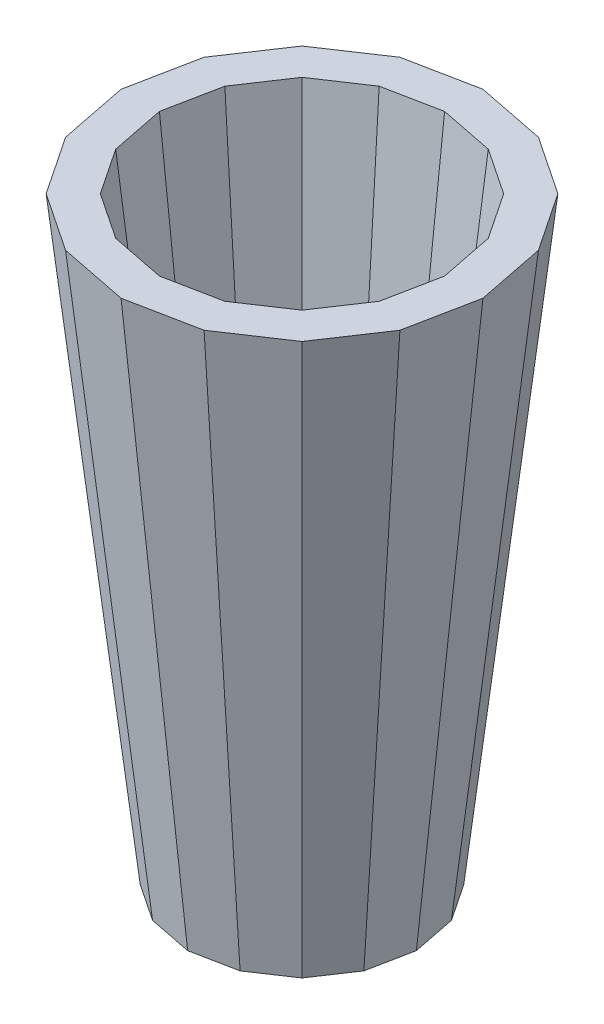
ISO-10303-21;
HEADER;
FILE_DESCRIPTION(('STEP AP214'),'2;1');
FILE_NAME('part.step','',(''),(''),'','','');
FILE_SCHEMA(('AUTOMOTIVE_DESIGN { 1 0 10303 214 1 1 1 1 }'));
ENDSEC;
DATA;
#1=APPLICATION_CONTEXT('core data for automotive mechanical design processes');
#2=APPLICATION_PROTOCOL_DEFINITION('international standard','automotive_design',2000,#1);
#3=PRODUCT_CONTEXT('',#1,'mechanical');
#4=PRODUCT('Part','Part','',(#3));
#5=PRODUCT_RELATED_PRODUCT_CATEGORY('part','',(#4));
#6=PRODUCT_DEFINITION_FORMATION('','',#4);
#7=PRODUCT_DEFINITION_CONTEXT('part definition',#1,'design');
#8=PRODUCT_DEFINITION('design','',#6,#7);
#9=PRODUCT_DEFINITION_SHAPE('','',#8);
#10=(LENGTH_UNIT() NAMED_UNIT(*) SI_UNIT(.MILLI.,.METRE.));
#11=(NAMED_UNIT(*) PLANE_ANGLE_UNIT() SI_UNIT($,.RADIAN.));
#12=(NAMED_UNIT(*) SI_UNIT($,.STERADIAN.) SOLID_ANGLE_UNIT());
#13=UNCERTAINTY_MEASURE_WITH_UNIT(LENGTH_MEASURE(1.E-05),#10,'distance_accuracy_value','');
#14=(GEOMETRIC_REPRESENTATION_CONTEXT(3) GLOBAL_UNCERTAINTY_ASSIGNED_CONTEXT((#13)) GLOBAL_UNIT_ASSIGNED_CONTEXT((#10,
#11,#12)) REPRESENTATION_CONTEXT('',''));
#15=CARTESIAN_POINT('',(0.,0.,0.));
#16=DIRECTION('',(0.,0.,1.));
#17=DIRECTION('',(1.,0.,0.));
#18=AXIS2_PLACEMENT_3D('',#15,#16,#17);
#19=CARTESIAN_POINT('',(97.0556592579951,-12.7354806909715,-64.8505182053685));
#20=DIRECTION('',(0.826564580597358,-0.108460416801212,-0.552292795615895));
#21=DIRECTION('',(-0.555570233019613,0.,-0.831469612302538));
#22=AXIS2_PLACEMENT_3D('',#19,#20,#21);
#23=PLANE('',#22);
#24=DIRECTION('',(-0.0781774113603298,-0.993869500843041,0.078177411360331));
#25=VECTOR('',#24,1.);
#26=CARTESIAN_POINT('',(85.1578574082435,0.,-85.1578574082452));
#27=LINE('',#26,#25);
#28=CARTESIAN_POINT('',(65.1783103261767,-254.,-65.1783103261781));
#29=VERTEX_POINT('',#28);
#30=CARTESIAN_POINT('',(41.2028538276966,-558.8,-41.2028538276976));
#31=VERTEX_POINT('',#30);
#32=EDGE_CURVE('E74',#29,#31,#27,.T.);
#33=ORIENTED_EDGE('',*,*,#32,.F.);
#34=DIRECTION('',(0.555570233019613,0.,0.831469612302538));
#35=VECTOR('',#34,1.);
#36=CARTESIAN_POINT('',(75.1689383557895,-254.,-50.2262788444126));
#37=LINE('',#36,#35);
#38=CARTESIAN_POINT('',(85.1595663854025,-254.,-35.2742473626468));
#39=VERTEX_POINT('',#38);
#40=EDGE_CURVE('E342',#29,#39,#37,.T.);
#41=ORIENTED_EDGE('',*,*,#40,.T.);
#42=DIRECTION('',(-0.102143710373313,-0.993869500843041,0.0423093101477368));
#43=VECTOR('',#42,1.);
#44=CARTESIAN_POINT('',(111.264102657835,0.,-46.087100326149));
#45=LINE('',#44,#43);
#46=CARTESIAN_POINT('',(53.8341228584836,-558.8,-22.2988238064441));
#47=VERTEX_POINT('',#46);
#48=EDGE_CURVE('E389',#39,#47,#45,.T.);
#49=ORIENTED_EDGE('',*,*,#48,.T.);
#50=DIRECTION('',(-0.555570233019613,0.,-0.831469612302538));
#51=VECTOR('',#50,1.);
#52=CARTESIAN_POINT('',(53.8341228584836,-558.8,-22.2988238064441));
#53=LINE('',#52,#51);
#54=EDGE_CURVE('E767',#47,#31,#53,.T.);
#55=ORIENTED_EDGE('',*,*,#54,.T.);
#56=EDGE_LOOP('',(#33,#41,#49,#55));
#57=FACE_BOUND('',#56,.T.);
#58=ADVANCED_FACE('F69',(#57),#23,.T.);
#59=CARTESIAN_POINT('',(64.850518205366,-12.7354806909714,-97.0556592579967));
#60=DIRECTION('',(0.552292795615874,-0.108460416801212,-0.826564580597372));
#61=DIRECTION('',(-0.831469612302552,0.,-0.555570233019592));
#62=AXIS2_PLACEMENT_3D('',#59,#60,#61);
#63=PLANE('',#62);
#64=DIRECTION('',(-0.0423093101477349,-0.993869500843041,0.102143710373314));
#65=VECTOR('',#64,1.);
#66=CARTESIAN_POINT('',(46.0871003261467,0.,-111.264102657836));
#67=LINE('',#66,#65);
#68=CARTESIAN_POINT('',(35.2742473626449,-254.,-85.1595663854033));
#69=VERTEX_POINT('',#68);
#70=CARTESIAN_POINT('',(22.2988238064429,-558.8,-53.8341228584841));
#71=VERTEX_POINT('',#70);
#72=EDGE_CURVE('E655',#69,#71,#67,.T.);
#73=ORIENTED_EDGE('',*,*,#72,.F.);
#74=DIRECTION('',(0.831469612302552,0.,0.555570233019592));
#75=VECTOR('',#74,1.);
#76=CARTESIAN_POINT('',(50.2262788444106,-254.,-75.1689383557908));
#77=LINE('',#76,#75);
#78=EDGE_CURVE('E87',#69,#29,#77,.T.);
#79=ORIENTED_EDGE('',*,*,#78,.T.);
#80=ORIENTED_EDGE('',*,*,#32,.T.);
#81=DIRECTION('',(-0.831469612302552,0.,-0.555570233019592));
#82=VECTOR('',#81,1.);
#83=CARTESIAN_POINT('',(41.2028538276966,-558.8,-41.2028538276976));
#84=LINE('',#83,#82);
#85=EDGE_CURVE('E603',#31,#71,#84,.T.);
#86=ORIENTED_EDGE('',*,*,#85,.T.);
#87=EDGE_LOOP('',(#73,#79,#80,#86));
#88=FACE_BOUND('',#87,.T.);
#89=ADVANCED_FACE('F610',(#88),#63,.T.);
#90=CARTESIAN_POINT('',(114.484956000336,-12.7354806909715,-22.7724736273844));
#91=DIRECTION('',(0.974999401009477,-0.108460416801212,-0.193939439048556));
#92=DIRECTION('',(-0.195090322016141,0.,-0.980785280403228));
#93=AXIS2_PLACEMENT_3D('',#90,#91,#92);
#94=PLANE('',#93);
#95=ORIENTED_EDGE('',*,*,#48,.F.);
#96=DIRECTION('',(0.195090322016141,0.,0.980785280403228));
#97=VECTOR('',#96,1.);
#98=CARTESIAN_POINT('',(88.6678084106225,-254.,-17.637123681324));
#99=LINE('',#98,#97);
#100=CARTESIAN_POINT('',(92.1760504358424,-254.,-1.04255233460427E-12));
#101=VERTEX_POINT('',#100);
#102=EDGE_CURVE('E874',#39,#101,#99,.T.);
#103=ORIENTED_EDGE('',*,*,#102,.T.);
#104=DIRECTION('',(-0.110559555417,-0.993869500843041,0.));
#105=VECTOR('',#104,1.);
#106=CARTESIAN_POINT('',(120.431396889373,0.,-1.3015092548858E-12));
#107=LINE('',#106,#105);
#108=CARTESIAN_POINT('',(58.2696346916054,-558.8,-7.27951394812149E-13));
#109=VERTEX_POINT('',#108);
#110=EDGE_CURVE('E387',#101,#109,#107,.T.);
#111=ORIENTED_EDGE('',*,*,#110,.T.);
#112=DIRECTION('',(-0.195090322016141,0.,-0.980785280403228));
#113=VECTOR('',#112,1.);
#114=CARTESIAN_POINT('',(58.2696346916054,-558.8,-7.27951394812149E-13));
#115=LINE('',#114,#113);
#116=EDGE_CURVE('E785',#109,#47,#115,.T.);
#117=ORIENTED_EDGE('',*,*,#116,.T.);
#118=EDGE_LOOP('',(#95,#103,#111,#117));
#119=FACE_BOUND('',#118,.T.);
#120=ADVANCED_FACE('F619',(#119),#94,.T.);
#121=CARTESIAN_POINT('',(114.484956000337,-12.7354806909714,22.7724736273815));
#122=DIRECTION('',(0.974999401009482,-0.108460416801212,0.193939439048532));
#123=DIRECTION('',(0.195090322016116,0.,-0.980785280403233));
#124=AXIS2_PLACEMENT_3D('',#121,#122,#123);
#125=PLANE('',#124);
#126=ORIENTED_EDGE('',*,*,#110,.F.);
#127=DIRECTION('',(-0.195090322016116,0.,0.980785280403233));
#128=VECTOR('',#127,1.);
#129=CARTESIAN_POINT('',(88.6678084106229,-254.,17.6371236813218));
#130=LINE('',#129,#128);
#131=CARTESIAN_POINT('',(85.1595663854032,-254.,35.2742473626449));
#132=VERTEX_POINT('',#131);
#133=EDGE_CURVE('E876',#101,#132,#130,.T.);
#134=ORIENTED_EDGE('',*,*,#133,.T.);
#135=DIRECTION('',(-0.102143710373314,-0.993869500843041,-0.0423093101477351));
#136=VECTOR('',#135,1.);
#137=CARTESIAN_POINT('',(111.264102657836,0.,46.0871003261467));
#138=LINE('',#137,#136);
#139=CARTESIAN_POINT('',(53.8341228584841,-558.8,22.2988238064428));
#140=VERTEX_POINT('',#139);
#141=EDGE_CURVE('E383',#132,#140,#138,.T.);
#142=ORIENTED_EDGE('',*,*,#141,.T.);
#143=DIRECTION('',(0.195090322016116,0.,-0.980785280403233));
#144=VECTOR('',#143,1.);
#145=CARTESIAN_POINT('',(53.8341228584841,-558.8,22.2988238064428));
#146=LINE('',#145,#144);
#147=EDGE_CURVE('E640',#140,#109,#146,.T.);
#148=ORIENTED_EDGE('',*,*,#147,.T.);
#149=EDGE_LOOP('',(#126,#134,#142,#148));
#150=FACE_BOUND('',#149,.T.);
#151=ADVANCED_FACE('F418',(#150),#125,.T.);
#152=CARTESIAN_POINT('',(97.0556592579967,-12.7354806909714,64.850518205366));
#153=DIRECTION('',(0.826564580597372,-0.108460416801212,0.552292795615874));
#154=DIRECTION('',(0.555570233019592,0.,-0.831469612302552));
#155=AXIS2_PLACEMENT_3D('',#152,#153,#154);
#156=PLANE('',#155);
#157=ORIENTED_EDGE('',*,*,#141,.F.);
#158=DIRECTION('',(-0.555570233019592,0.,0.831469612302552));
#159=VECTOR('',#158,1.);
#160=CARTESIAN_POINT('',(75.1689383557908,-254.,50.2262788444106));
#161=LINE('',#160,#159);
#162=CARTESIAN_POINT('',(65.1783103261781,-254.,65.1783103261767));
#163=VERTEX_POINT('',#162);
#164=EDGE_CURVE('E877',#132,#163,#161,.T.);
#165=ORIENTED_EDGE('',*,*,#164,.T.);
#166=DIRECTION('',(-0.0781774113603309,-0.993869500843041,-0.0781774113603299));
#167=VECTOR('',#166,1.);
#168=CARTESIAN_POINT('',(85.1578574082452,0.,85.1578574082436));
#169=LINE('',#168,#167);
#170=CARTESIAN_POINT('',(41.2028538276976,-558.8,41.2028538276966));
#171=VERTEX_POINT('',#170);
#172=EDGE_CURVE('E380',#163,#171,#169,.T.);
#173=ORIENTED_EDGE('',*,*,#172,.T.);
#174=DIRECTION('',(0.555570233019592,0.,-0.831469612302552));
#175=VECTOR('',#174,1.);
#176=CARTESIAN_POINT('',(41.2028538276976,-558.8,41.2028538276966));
#177=LINE('',#176,#175);
#178=EDGE_CURVE('E399',#171,#140,#177,.T.);
#179=ORIENTED_EDGE('',*,*,#178,.T.);
#180=EDGE_LOOP('',(#157,#165,#173,#179));
#181=FACE_BOUND('',#180,.T.);
#182=ADVANCED_FACE('F407',(#181),#156,.T.);
#183=CARTESIAN_POINT('',(64.8505182053685,-12.7354806909714,97.055659257995));
#184=DIRECTION('',(0.552292795615894,-0.108460416801212,0.826564580597358));
#185=DIRECTION('',(0.831469612302538,0.,-0.555570233019613));
#186=AXIS2_PLACEMENT_3D('',#183,#184,#185);
#187=PLANE('',#186);
#188=ORIENTED_EDGE('',*,*,#172,.F.);
#189=DIRECTION('',(-0.831469612302538,0.,0.555570233019613));
#190=VECTOR('',#189,1.);
#191=CARTESIAN_POINT('',(50.2262788444125,-254.,75.1689383557895));
#192=LINE('',#191,#190);
#193=CARTESIAN_POINT('',(35.2742473626467,-254.,85.1595663854025));
#194=VERTEX_POINT('',#193);
#195=EDGE_CURVE('E841',#163,#194,#192,.T.);
#196=ORIENTED_EDGE('',*,*,#195,.T.);
#197=DIRECTION('',(-0.0423093101477364,-0.993869500843041,-0.102143710373313));
#198=VECTOR('',#197,1.);
#199=CARTESIAN_POINT('',(46.0871003261488,0.,111.264102657835));
#200=LINE('',#199,#198);
#201=CARTESIAN_POINT('',(22.2988238064442,-558.8,53.8341228584836));
#202=VERTEX_POINT('',#201);
#203=EDGE_CURVE('E384',#194,#202,#200,.T.);
#204=ORIENTED_EDGE('',*,*,#203,.T.);
#205=DIRECTION('',(0.831469612302538,0.,-0.555570233019613));
#206=VECTOR('',#205,1.);
#207=CARTESIAN_POINT('',(22.2988238064442,-558.8,53.8341228584836));
#208=LINE('',#207,#206);
#209=EDGE_CURVE('E656',#202,#171,#208,.T.);
#210=ORIENTED_EDGE('',*,*,#209,.T.);
#211=EDGE_LOOP('',(#188,#196,#204,#210));
#212=FACE_BOUND('',#211,.T.);
#213=ADVANCED_FACE('F417',(#212),#187,.T.);
#214=CARTESIAN_POINT('',(22.7724736273844,-12.7354806909714,114.484956000336));
#215=DIRECTION('',(0.193939439048556,-0.108460416801212,0.974999401009477));
#216=DIRECTION('',(0.980785280403228,0.,-0.195090322016141));
#217=AXIS2_PLACEMENT_3D('',#214,#215,#216);
#218=PLANE('',#217);
#219=ORIENTED_EDGE('',*,*,#203,.F.);
#220=DIRECTION('',(-0.980785280403228,0.,0.195090322016141));
#221=VECTOR('',#220,1.);
#222=CARTESIAN_POINT('',(17.637123681324,-254.,88.6678084106224));
#223=LINE('',#222,#221);
#224=CARTESIAN_POINT('',(8.93843344847888E-13,-254.,92.1760504358424));
#225=VERTEX_POINT('',#224);
#226=EDGE_CURVE('E842',#194,#225,#223,.T.);
#227=ORIENTED_EDGE('',*,*,#226,.T.);
#228=DIRECTION('',(0.,-0.993869500843041,-0.110559555417));
#229=VECTOR('',#228,1.);
#230=CARTESIAN_POINT('',(1.02791653552152E-12,0.,120.431396889373));
#231=LINE('',#230,#229);
#232=CARTESIAN_POINT('',(7.14887218187419E-13,-558.8,58.2696346916054));
#233=VERTEX_POINT('',#232);
#234=EDGE_CURVE('E833',#225,#233,#231,.T.);
#235=ORIENTED_EDGE('',*,*,#234,.T.);
#236=DIRECTION('',(0.980785280403228,0.,-0.195090322016141));
#237=VECTOR('',#236,1.);
#238=CARTESIAN_POINT('',(7.14887218187419E-13,-558.8,58.2696346916054));
#239=LINE('',#238,#237);
#240=EDGE_CURVE('E441',#233,#202,#239,.T.);
#241=ORIENTED_EDGE('',*,*,#240,.T.);
#242=EDGE_LOOP('',(#219,#227,#235,#241));
#243=FACE_BOUND('',#242,.T.);
#244=ADVANCED_FACE('F424',(#243),#218,.T.);
#245=CARTESIAN_POINT('',(-22.7724736273815,-12.7354806909714,114.484956000337));
#246=DIRECTION('',(-0.193939439048532,-0.108460416801212,0.974999401009482));
#247=DIRECTION('',(0.980785280403233,0.,0.195090322016116));
#248=AXIS2_PLACEMENT_3D('',#245,#246,#247);
#249=PLANE('',#248);
#250=ORIENTED_EDGE('',*,*,#234,.F.);
#251=DIRECTION('',(-0.980785280403233,0.,-0.195090322016116));
#252=VECTOR('',#251,1.);
#253=CARTESIAN_POINT('',(-17.6371236813218,-254.,88.6678084106229));
#254=LINE('',#253,#252);
#255=CARTESIAN_POINT('',(-35.2742473626449,-254.,85.1595663854033));
#256=VERTEX_POINT('',#255);
#257=EDGE_CURVE('E843',#225,#256,#254,.T.);
#258=ORIENTED_EDGE('',*,*,#257,.T.);
#259=DIRECTION('',(0.0423093101477349,-0.993869500843041,-0.102143710373314));
#260=VECTOR('',#259,1.);
#261=CARTESIAN_POINT('',(-46.0871003261466,0.,111.264102657836));
#262=LINE('',#261,#260);
#263=CARTESIAN_POINT('',(-22.2988238064428,-558.8,53.8341228584841));
#264=VERTEX_POINT('',#263);
#265=EDGE_CURVE('E832',#256,#264,#262,.T.);
#266=ORIENTED_EDGE('',*,*,#265,.T.);
#267=DIRECTION('',(0.980785280403233,0.,0.195090322016116));
#268=VECTOR('',#267,1.);
#269=CARTESIAN_POINT('',(-22.2988238064428,-558.8,53.8341228584841));
#270=LINE('',#269,#268);
#271=EDGE_CURVE('E455',#264,#233,#270,.T.);
#272=ORIENTED_EDGE('',*,*,#271,.T.);
#273=EDGE_LOOP('',(#250,#258,#266,#272));
#274=FACE_BOUND('',#273,.T.);
#275=ADVANCED_FACE('F461',(#274),#249,.T.);
#276=CARTESIAN_POINT('',(-64.8505182053661,-12.7354806909714,97.0556592579966));
#277=DIRECTION('',(-0.552292795615874,-0.108460416801212,0.826564580597372));
#278=DIRECTION('',(0.831469612302552,0.,0.555570233019592));
#279=AXIS2_PLACEMENT_3D('',#276,#277,#278);
#280=PLANE('',#279);
#281=ORIENTED_EDGE('',*,*,#265,.F.);
#282=DIRECTION('',(-0.831469612302552,0.,-0.555570233019592));
#283=VECTOR('',#282,1.);
#284=CARTESIAN_POINT('',(-50.2262788444107,-254.,75.1689383557907));
#285=LINE('',#284,#283);
#286=CARTESIAN_POINT('',(-65.1783103261767,-254.,65.178310326178));
#287=VERTEX_POINT('',#286);
#288=EDGE_CURVE('E847',#256,#287,#285,.T.);
#289=ORIENTED_EDGE('',*,*,#288,.T.);
#290=DIRECTION('',(0.0781774113603299,-0.993869500843041,-0.0781774113603309));
#291=VECTOR('',#290,1.);
#292=CARTESIAN_POINT('',(-85.1578574082436,0.,85.1578574082451));
#293=LINE('',#292,#291);
#294=CARTESIAN_POINT('',(-41.2028538276966,-558.8,41.2028538276976));
#295=VERTEX_POINT('',#294);
#296=EDGE_CURVE('E830',#287,#295,#293,.T.);
#297=ORIENTED_EDGE('',*,*,#296,.T.);
#298=DIRECTION('',(0.831469612302552,0.,0.555570233019592));
#299=VECTOR('',#298,1.);
#300=CARTESIAN_POINT('',(-41.2028538276966,-558.8,41.2028538276976));
#301=LINE('',#300,#299);
#302=EDGE_CURVE('E692',#295,#264,#301,.T.);
#303=ORIENTED_EDGE('',*,*,#302,.T.);
#304=EDGE_LOOP('',(#281,#289,#297,#303));
#305=FACE_BOUND('',#304,.T.);
#306=ADVANCED_FACE('F470',(#305),#280,.T.);
#307=CARTESIAN_POINT('',(-97.055659257995,-12.7354806909715,64.8505182053685));
#308=DIRECTION('',(-0.826564580597358,-0.108460416801212,0.552292795615895));
#309=DIRECTION('',(0.555570233019613,0.,0.831469612302538));
#310=AXIS2_PLACEMENT_3D('',#307,#308,#309);
#311=PLANE('',#310);
#312=ORIENTED_EDGE('',*,*,#296,.F.);
#313=DIRECTION('',(-0.555570233019613,0.,-0.831469612302538));
#314=VECTOR('',#313,1.);
#315=CARTESIAN_POINT('',(-75.1689383557895,-254.,50.2262788444126));
#316=LINE('',#315,#314);
#317=CARTESIAN_POINT('',(-85.1595663854025,-254.,35.2742473626467));
#318=VERTEX_POINT('',#317);
#319=EDGE_CURVE('E926',#287,#318,#316,.T.);
#320=ORIENTED_EDGE('',*,*,#319,.T.);
#321=DIRECTION('',(0.102143710373313,-0.993869500843041,-0.0423093101477365));
#322=VECTOR('',#321,1.);
#323=CARTESIAN_POINT('',(-111.264102657835,0.,46.0871003261489));
#324=LINE('',#323,#322);
#325=CARTESIAN_POINT('',(-53.8341228584836,-558.8,22.2988238064441));
#326=VERTEX_POINT('',#325);
#327=EDGE_CURVE('E828',#318,#326,#324,.T.);
#328=ORIENTED_EDGE('',*,*,#327,.T.);
#329=DIRECTION('',(0.555570233019613,0.,0.831469612302538));
#330=VECTOR('',#329,1.);
#331=CARTESIAN_POINT('',(-53.8341228584836,-558.8,22.2988238064441));
#332=LINE('',#331,#330);
#333=EDGE_CURVE('E491',#326,#295,#332,.T.);
#334=ORIENTED_EDGE('',*,*,#333,.T.);
#335=EDGE_LOOP('',(#312,#320,#328,#334));
#336=FACE_BOUND('',#335,.T.);
#337=ADVANCED_FACE('F474',(#336),#311,.T.);
#338=CARTESIAN_POINT('',(-114.484956000336,-12.7354806909715,22.7724736273844));
#339=DIRECTION('',(-0.974999401009477,-0.108460416801212,0.193939439048556));
#340=DIRECTION('',(0.19509032201614,0.,0.980785280403228));
#341=AXIS2_PLACEMENT_3D('',#338,#339,#340);
#342=PLANE('',#341);
#343=ORIENTED_EDGE('',*,*,#327,.F.);
#344=DIRECTION('',(-0.19509032201614,0.,-0.980785280403228));
#345=VECTOR('',#344,1.);
#346=CARTESIAN_POINT('',(-88.6678084106224,-254.,17.637123681324));
#347=LINE('',#346,#345);
#348=CARTESIAN_POINT('',(-92.1760504358424,-254.,9.89884406966494E-13));
#349=VERTEX_POINT('',#348);
#350=EDGE_CURVE('E923',#318,#349,#347,.T.);
#351=ORIENTED_EDGE('',*,*,#350,.T.);
#352=DIRECTION('',(0.110559555417,-0.993869500843041,0.));
#353=VECTOR('',#352,1.);
#354=CARTESIAN_POINT('',(-120.431396889373,0.,1.19026914763061E-12));
#355=LINE('',#354,#353);
#356=CARTESIAN_POINT('',(-58.2696346916054,-558.8,7.28926824738035E-13));
#357=VERTEX_POINT('',#356);
#358=EDGE_CURVE('E818',#349,#357,#355,.T.);
#359=ORIENTED_EDGE('',*,*,#358,.T.);
#360=DIRECTION('',(0.19509032201614,0.,0.980785280403228));
#361=VECTOR('',#360,1.);
#362=CARTESIAN_POINT('',(-58.2696346916054,-558.8,7.28926824738035E-13));
#363=LINE('',#362,#361);
#364=EDGE_CURVE('E505',#357,#326,#363,.T.);
#365=ORIENTED_EDGE('',*,*,#364,.T.);
#366=EDGE_LOOP('',(#343,#351,#359,#365));
#367=FACE_BOUND('',#366,.T.);
#368=ADVANCED_FACE('F511',(#367),#342,.T.);
#369=CARTESIAN_POINT('',(-114.484956000337,-12.7354806909714,-22.7724736273815));
#370=DIRECTION('',(-0.974999401009482,-0.108460416801212,-0.193939439048532));
#371=DIRECTION('',(-0.195090322016116,0.,0.980785280403233));
#372=AXIS2_PLACEMENT_3D('',#369,#370,#371);
#373=PLANE('',#372);
#374=ORIENTED_EDGE('',*,*,#358,.F.);
#375=DIRECTION('',(0.195090322016116,0.,-0.980785280403233));
#376=VECTOR('',#375,1.);
#377=CARTESIAN_POINT('',(-88.6678084106228,-254.,-17.6371236813218));
#378=LINE('',#377,#376);
#379=CARTESIAN_POINT('',(-85.1595663854032,-254.,-35.2742473626449));
#380=VERTEX_POINT('',#379);
#381=EDGE_CURVE('E920',#349,#380,#378,.T.);
#382=ORIENTED_EDGE('',*,*,#381,.T.);
#383=DIRECTION('',(0.102143710373314,-0.993869500843041,0.0423093101477353));
#384=VECTOR('',#383,1.);
#385=CARTESIAN_POINT('',(-111.264102657836,0.,-46.0871003261468));
#386=LINE('',#385,#384);
#387=CARTESIAN_POINT('',(-53.8341228584841,-558.8,-22.2988238064427));
#388=VERTEX_POINT('',#387);
#389=EDGE_CURVE('E816',#380,#388,#386,.T.);
#390=ORIENTED_EDGE('',*,*,#389,.T.);
#391=DIRECTION('',(-0.195090322016116,0.,0.980785280403233));
#392=VECTOR('',#391,1.);
#393=CARTESIAN_POINT('',(-53.8341228584841,-558.8,-22.2988238064427));
#394=LINE('',#393,#392);
#395=EDGE_CURVE('E712',#388,#357,#394,.T.);
#396=ORIENTED_EDGE('',*,*,#395,.T.);
#397=EDGE_LOOP('',(#374,#382,#390,#396));
#398=FACE_BOUND('',#397,.T.);
#399=ADVANCED_FACE('F520',(#398),#373,.T.);
#400=CARTESIAN_POINT('',(-97.0556592579967,-12.7354806909714,-64.850518205366));
#401=DIRECTION('',(-0.826564580597372,-0.108460416801212,-0.552292795615874));
#402=DIRECTION('',(-0.555570233019592,0.,0.831469612302552));
#403=AXIS2_PLACEMENT_3D('',#400,#401,#402);
#404=PLANE('',#403);
#405=ORIENTED_EDGE('',*,*,#389,.F.);
#406=DIRECTION('',(0.555570233019592,0.,-0.831469612302552));
#407=VECTOR('',#406,1.);
#408=CARTESIAN_POINT('',(-75.1689383557908,-254.,-50.2262788444106));
#409=LINE('',#408,#407);
#410=CARTESIAN_POINT('',(-65.1783103261781,-254.,-65.1783103261767));
#411=VERTEX_POINT('',#410);
#412=EDGE_CURVE('E917',#380,#411,#409,.T.);
#413=ORIENTED_EDGE('',*,*,#412,.T.);
#414=DIRECTION('',(0.0781774113603309,-0.993869500843041,0.0781774113603299));
#415=VECTOR('',#414,1.);
#416=CARTESIAN_POINT('',(-85.1578574082452,0.,-85.1578574082436));
#417=LINE('',#416,#415);
#418=CARTESIAN_POINT('',(-41.2028538276976,-558.8,-41.2028538276965));
#419=VERTEX_POINT('',#418);
#420=EDGE_CURVE('E814',#411,#419,#417,.T.);
#421=ORIENTED_EDGE('',*,*,#420,.T.);
#422=DIRECTION('',(-0.555570233019592,0.,0.831469612302552));
#423=VECTOR('',#422,1.);
#424=CARTESIAN_POINT('',(-41.2028538276976,-558.8,-41.2028538276965));
#425=LINE('',#424,#423);
#426=EDGE_CURVE('E541',#419,#388,#425,.T.);
#427=ORIENTED_EDGE('',*,*,#426,.T.);
#428=EDGE_LOOP('',(#405,#413,#421,#427));
#429=FACE_BOUND('',#428,.T.);
#430=ADVANCED_FACE('F524',(#429),#404,.T.);
#431=CARTESIAN_POINT('',(-64.8505182053685,-12.7354806909715,-97.0556592579951));
#432=DIRECTION('',(-0.552292795615894,-0.108460416801212,-0.826564580597358));
#433=DIRECTION('',(-0.831469612302538,0.,0.555570233019612));
#434=AXIS2_PLACEMENT_3D('',#431,#432,#433);
#435=PLANE('',#434);
#436=ORIENTED_EDGE('',*,*,#420,.F.);
#437=DIRECTION('',(0.831469612302538,0.,-0.555570233019612));
#438=VECTOR('',#437,1.);
#439=CARTESIAN_POINT('',(-50.2262788444125,-254.,-75.1689383557895));
#440=LINE('',#439,#438);
#441=CARTESIAN_POINT('',(-35.2742473626466,-254.,-85.1595663854025));
#442=VERTEX_POINT('',#441);
#443=EDGE_CURVE('E914',#411,#442,#440,.T.);
#444=ORIENTED_EDGE('',*,*,#443,.T.);
#445=DIRECTION('',(0.0423093101477363,-0.993869500843041,0.102143710373313));
#446=VECTOR('',#445,1.);
#447=CARTESIAN_POINT('',(-46.0871003261487,0.,-111.264102657835));
#448=LINE('',#447,#446);
#449=CARTESIAN_POINT('',(-22.2988238064441,-558.8,-53.8341228584835));
#450=VERTEX_POINT('',#449);
#451=EDGE_CURVE('E812',#442,#450,#448,.T.);
#452=ORIENTED_EDGE('',*,*,#451,.T.);
#453=DIRECTION('',(-0.831469612302538,0.,0.555570233019612));
#454=VECTOR('',#453,1.);
#455=CARTESIAN_POINT('',(-22.2988238064441,-558.8,-53.8341228584835));
#456=LINE('',#455,#454);
#457=EDGE_CURVE('E555',#450,#419,#456,.T.);
#458=ORIENTED_EDGE('',*,*,#457,.T.);
#459=EDGE_LOOP('',(#436,#444,#452,#458));
#460=FACE_BOUND('',#459,.T.);
#461=ADVANCED_FACE('F561',(#460),#435,.T.);
#462=CARTESIAN_POINT('',(-22.7724736273844,-12.7354806909715,-114.484956000336));
#463=DIRECTION('',(-0.193939439048556,-0.108460416801212,-0.974999401009477));
#464=DIRECTION('',(-0.980785280403228,0.,0.195090322016141));
#465=AXIS2_PLACEMENT_3D('',#462,#463,#464);
#466=PLANE('',#465);
#467=ORIENTED_EDGE('',*,*,#451,.F.);
#468=DIRECTION('',(0.980785280403228,0.,-0.195090322016141));
#469=VECTOR('',#468,1.);
#470=CARTESIAN_POINT('',(-17.637123681324,-254.,-88.6678084106224));
#471=LINE('',#470,#469);
#472=CARTESIAN_POINT('',(-9.65712964078461E-13,-254.,-92.1760504358424));
#473=VERTEX_POINT('',#472);
#474=EDGE_CURVE('E911',#442,#473,#471,.T.);
#475=ORIENTED_EDGE('',*,*,#474,.T.);
#476=DIRECTION('',(0.,-0.993869500843041,0.110559555417));
#477=VECTOR('',#476,1.);
#478=CARTESIAN_POINT('',(-1.14021109936577E-12,0.,-120.431396889373));
#479=LINE('',#478,#477);
#480=CARTESIAN_POINT('',(-7.51337183597178E-13,-558.8,-58.2696346916053));
#481=VERTEX_POINT('',#480);
#482=EDGE_CURVE('E801',#473,#481,#479,.T.);
#483=ORIENTED_EDGE('',*,*,#482,.T.);
#484=DIRECTION('',(-0.980785280403228,0.,0.195090322016141));
#485=VECTOR('',#484,1.);
#486=CARTESIAN_POINT('',(-7.51337183597178E-13,-558.8,-58.2696346916053));
#487=LINE('',#486,#485);
#488=EDGE_CURVE('E747',#481,#450,#487,.T.);
#489=ORIENTED_EDGE('',*,*,#488,.T.);
#490=EDGE_LOOP('',(#467,#475,#483,#489));
#491=FACE_BOUND('',#490,.T.);
#492=ADVANCED_FACE('F570',(#491),#466,.T.);
#493=CARTESIAN_POINT('',(22.7724736273815,-12.7354806909715,-114.484956000337));
#494=DIRECTION('',(0.193939439048532,-0.108460416801212,-0.974999401009482));
#495=DIRECTION('',(-0.980785280403233,0.,-0.195090322016116));
#496=AXIS2_PLACEMENT_3D('',#493,#494,#495);
#497=PLANE('',#496);
#498=ORIENTED_EDGE('',*,*,#482,.F.);
#499=DIRECTION('',(0.980785280403233,0.,0.195090322016116));
#500=VECTOR('',#499,1.);
#501=CARTESIAN_POINT('',(17.6371236813218,-254.,-88.6678084106229));
#502=LINE('',#501,#500);
#503=EDGE_CURVE('E909',#473,#69,#502,.T.);
#504=ORIENTED_EDGE('',*,*,#503,.T.);
#505=ORIENTED_EDGE('',*,*,#72,.T.);
#506=DIRECTION('',(-0.980785280403233,0.,-0.195090322016116));
#507=VECTOR('',#506,1.);
#508=CARTESIAN_POINT('',(22.2988238064429,-558.8,-53.8341228584841));
#509=LINE('',#508,#507);
#510=EDGE_CURVE('E589',#71,#481,#509,.T.);
#511=ORIENTED_EDGE('',*,*,#510,.T.);
#512=EDGE_LOOP('',(#498,#504,#505,#511));
#513=FACE_BOUND('',#512,.T.);
#514=ADVANCED_FACE('F573',(#513),#497,.T.);
#515=CARTESIAN_POINT('',(81.3096039976154,-10.6693097509084,-54.3293404488857));
#516=DIRECTION('',(0.826564580597358,-0.108460416801212,-0.552292795615895));
#517=DIRECTION('',(-0.555570233019613,0.,-0.831469612302538));
#518=AXIS2_PLACEMENT_3D('',#515,#516,#517);
#519=PLANE('',#518);
#520=DIRECTION('',(0.555570233019613,0.,0.831469612302538));
#521=VECTOR('',#520,1.);
#522=CARTESIAN_POINT('',(59.23544688709,-254.,-39.5798602175578));
#523=LINE('',#522,#521);
#524=CARTESIAN_POINT('',(51.3625231906597,-254.,-51.3625231906608));
#525=VERTEX_POINT('',#524);
#526=CARTESIAN_POINT('',(67.1083705835203,-254.,-27.7971972444547));
#527=VERTEX_POINT('',#526);
#528=EDGE_CURVE('E291',#525,#527,#523,.T.);
#529=ORIENTED_EDGE('',*,*,#528,.F.);
#530=DIRECTION('',(-0.0781774113603295,-0.993869500843041,0.0781774113603312));
#531=VECTOR('',#530,1.);
#532=CARTESIAN_POINT('',(70.4700265198488,-11.086293013605,-70.4700265198503));
#533=LINE('',#532,#531);
#534=CARTESIAN_POINT('',(27.3870666921796,-558.8,-27.3870666921802));
#535=VERTEX_POINT('',#534);
#536=EDGE_CURVE('E290',#525,#535,#533,.T.);
#537=ORIENTED_EDGE('',*,*,#536,.T.);
#538=DIRECTION('',(-0.555570233019613,0.,-0.831469612302538));
#539=VECTOR('',#538,1.);
#540=CARTESIAN_POINT('',(31.5849968743905,-558.8,-21.1044201902161));
#541=LINE('',#540,#539);
#542=CARTESIAN_POINT('',(35.7829270566015,-558.8,-14.8217736882519));
#543=VERTEX_POINT('',#542);
#544=EDGE_CURVE('E333',#543,#535,#541,.T.);
#545=ORIENTED_EDGE('',*,*,#544,.F.);
#546=DIRECTION('',(-0.102143710373313,-0.993869500843041,0.0423093101477372));
#547=VECTOR('',#546,1.);
#548=CARTESIAN_POINT('',(92.073526784691,-11.086293013605,-38.1381035297428));
#549=LINE('',#548,#547);
#550=EDGE_CURVE('E332',#527,#543,#549,.T.);
#551=ORIENTED_EDGE('',*,*,#550,.F.);
#552=EDGE_LOOP('',(#529,#537,#545,#551));
#553=FACE_BOUND('',#552,.T.);
#554=ADVANCED_FACE('F891',(#553),#519,.F.);
#555=CARTESIAN_POINT('',(54.3293404488836,-10.6693097509084,-81.3096039976167));
#556=DIRECTION('',(0.552292795615874,-0.108460416801212,-0.826564580597372));
#557=DIRECTION('',(-0.831469612302552,0.,-0.555570233019592));
#558=AXIS2_PLACEMENT_3D('',#555,#556,#557);
#559=PLANE('',#558);
#560=DIRECTION('',(0.831469612302552,0.,0.555570233019592));
#561=VECTOR('',#560,1.);
#562=CARTESIAN_POINT('',(39.5798602175563,-254.,-59.2354468870909));
#563=LINE('',#562,#561);
#564=CARTESIAN_POINT('',(27.797197244453,-254.,-67.108370583521));
#565=VERTEX_POINT('',#564);
#566=EDGE_CURVE('E279',#565,#525,#563,.T.);
#567=ORIENTED_EDGE('',*,*,#566,.F.);
#568=DIRECTION('',(-0.0423093101477342,-0.993869500843041,0.102143710373314));
#569=VECTOR('',#568,1.);
#570=CARTESIAN_POINT('',(38.1381035297404,-11.086293013605,-92.073526784692));
#571=LINE('',#570,#569);
#572=CARTESIAN_POINT('',(14.8217736882511,-558.8,-35.7829270566018));
#573=VERTEX_POINT('',#572);
#574=EDGE_CURVE('E288',#565,#573,#571,.T.);
#575=ORIENTED_EDGE('',*,*,#574,.T.);
#576=DIRECTION('',(-0.831469612302552,0.,-0.555570233019592));
#577=VECTOR('',#576,1.);
#578=CARTESIAN_POINT('',(21.1044201902153,-558.8,-31.584996874391));
#579=LINE('',#578,#577);
#580=EDGE_CURVE('E336',#535,#573,#579,.T.);
#581=ORIENTED_EDGE('',*,*,#580,.F.);
#582=ORIENTED_EDGE('',*,*,#536,.F.);
#583=EDGE_LOOP('',(#567,#575,#581,#582));
#584=FACE_BOUND('',#583,.T.);
#585=ADVANCED_FACE('F286',(#584),#559,.F.);
#586=CARTESIAN_POINT('',(95.9112174111059,-10.6693097509084,-19.0779273135094));
#587=DIRECTION('',(0.974999401009477,-0.108460416801212,-0.193939439048556));
#588=DIRECTION('',(-0.195090322016141,0.,-0.980785280403228));
#589=AXIS2_PLACEMENT_3D('',#586,#587,#588);
#590=PLANE('',#589);
#591=DIRECTION('',(0.195090322016141,0.,0.980785280403228));
#592=VECTOR('',#591,1.);
#593=CARTESIAN_POINT('',(69.8729737387273,-254.,-13.8985986222278));
#594=LINE('',#593,#592);
#595=CARTESIAN_POINT('',(72.6375768939343,-254.,-1.01654795692241E-12));
#596=VERTEX_POINT('',#595);
#597=EDGE_CURVE('E292',#527,#596,#594,.T.);
#598=ORIENTED_EDGE('',*,*,#597,.F.);
#599=ORIENTED_EDGE('',*,*,#550,.T.);
#600=DIRECTION('',(-0.195090322016141,0.,-0.980785280403228));
#601=VECTOR('',#600,1.);
#602=CARTESIAN_POINT('',(37.2570441031494,-558.8,-7.41088684412626));
#603=LINE('',#602,#601);
#604=CARTESIAN_POINT('',(38.7311611496973,-558.8,-5.19844429068119E-13));
#605=VERTEX_POINT('',#604);
#606=EDGE_CURVE('E337',#605,#543,#603,.T.);
#607=ORIENTED_EDGE('',*,*,#606,.F.);
#608=DIRECTION('',(-0.110559555417,-0.993869500843041,0.));
#609=VECTOR('',#608,1.);
#610=CARTESIAN_POINT('',(99.6596672451629,-11.086293013605,-1.37043154602168E-12));
#611=LINE('',#610,#609);
#612=EDGE_CURVE('E330',#596,#605,#611,.T.);
#613=ORIENTED_EDGE('',*,*,#612,.F.);
#614=EDGE_LOOP('',(#598,#599,#607,#613));
#615=FACE_BOUND('',#614,.T.);
#616=ADVANCED_FACE('F894',(#615),#590,.F.);
#617=CARTESIAN_POINT('',(95.9112174111063,-10.6693097509084,19.077927313507));
#618=DIRECTION('',(0.974999401009482,-0.108460416801212,0.193939439048532));
#619=DIRECTION('',(0.195090322016116,0.,-0.980785280403233));
#620=AXIS2_PLACEMENT_3D('',#617,#618,#619);
#621=PLANE('',#620);
#622=DIRECTION('',(-0.195090322016116,0.,0.980785280403233));
#623=VECTOR('',#622,1.);
#624=CARTESIAN_POINT('',(69.8729737387276,-254.,13.8985986222261));
#625=LINE('',#624,#623);
#626=CARTESIAN_POINT('',(67.108370583521,-254.,27.797197244453));
#627=VERTEX_POINT('',#626);
#628=EDGE_CURVE('E899',#596,#627,#625,.T.);
#629=ORIENTED_EDGE('',*,*,#628,.F.);
#630=ORIENTED_EDGE('',*,*,#612,.T.);
#631=DIRECTION('',(0.195090322016116,0.,-0.980785280403233));
#632=VECTOR('',#631,1.);
#633=CARTESIAN_POINT('',(37.2570441031495,-558.8,7.41088684412532));
#634=LINE('',#633,#632);
#635=CARTESIAN_POINT('',(35.7829270566018,-558.8,14.821773688251));
#636=VERTEX_POINT('',#635);
#637=EDGE_CURVE('E340',#636,#605,#634,.T.);
#638=ORIENTED_EDGE('',*,*,#637,.F.);
#639=DIRECTION('',(-0.102143710373314,-0.993869500843041,-0.0423093101477346));
#640=VECTOR('',#639,1.);
#641=CARTESIAN_POINT('',(92.0735267846919,-11.086293013605,38.1381035297404));
#642=LINE('',#641,#640);
#643=EDGE_CURVE('E328',#627,#636,#642,.T.);
#644=ORIENTED_EDGE('',*,*,#643,.F.);
#645=EDGE_LOOP('',(#629,#630,#638,#644));
#646=FACE_BOUND('',#645,.T.);
#647=ADVANCED_FACE('F897',(#646),#621,.F.);
#648=CARTESIAN_POINT('',(81.3096039976167,-10.6693097509084,54.3293404488836));
#649=DIRECTION('',(0.826564580597372,-0.108460416801212,0.552292795615874));
#650=DIRECTION('',(0.555570233019592,0.,-0.831469612302552));
#651=AXIS2_PLACEMENT_3D('',#648,#649,#650);
#652=PLANE('',#651);
#653=DIRECTION('',(-0.555570233019592,0.,0.831469612302552));
#654=VECTOR('',#653,1.);
#655=CARTESIAN_POINT('',(59.2354468870909,-254.,39.5798602175563));
#656=LINE('',#655,#654);
#657=CARTESIAN_POINT('',(51.3625231906608,-254.,51.3625231906595));
#658=VERTEX_POINT('',#657);
#659=EDGE_CURVE('E901',#627,#658,#656,.T.);
#660=ORIENTED_EDGE('',*,*,#659,.F.);
#661=ORIENTED_EDGE('',*,*,#643,.T.);
#662=DIRECTION('',(0.555570233019592,0.,-0.831469612302552));
#663=VECTOR('',#662,1.);
#664=CARTESIAN_POINT('',(31.584996874391,-558.8,21.1044201902153));
#665=LINE('',#664,#663);
#666=CARTESIAN_POINT('',(27.3870666921802,-558.8,27.3870666921795));
#667=VERTEX_POINT('',#666);
#668=EDGE_CURVE('E299',#667,#636,#665,.T.);
#669=ORIENTED_EDGE('',*,*,#668,.F.);
#670=DIRECTION('',(-0.0781774113603313,-0.993869500843041,-0.0781774113603293));
#671=VECTOR('',#670,1.);
#672=CARTESIAN_POINT('',(70.4700265198504,-11.086293013605,70.4700265198486));
#673=LINE('',#672,#671);
#674=EDGE_CURVE('E326',#658,#667,#673,.T.);
#675=ORIENTED_EDGE('',*,*,#674,.F.);
#676=EDGE_LOOP('',(#660,#661,#669,#675));
#677=FACE_BOUND('',#676,.T.);
#678=ADVANCED_FACE('F952',(#677),#652,.F.);
#679=CARTESIAN_POINT('',(54.3293404488857,-10.6693097509084,81.3096039976154));
#680=DIRECTION('',(0.552292795615894,-0.108460416801212,0.826564580597358));
#681=DIRECTION('',(0.831469612302538,0.,-0.555570233019613));
#682=AXIS2_PLACEMENT_3D('',#679,#680,#681);
#683=PLANE('',#682);
#684=DIRECTION('',(-0.831469612302538,0.,0.555570233019613));
#685=VECTOR('',#684,1.);
#686=CARTESIAN_POINT('',(39.5798602175578,-254.,59.2354468870899));
#687=LINE('',#686,#685);
#688=CARTESIAN_POINT('',(27.7971972444547,-254.,67.1083705835203));
#689=VERTEX_POINT('',#688);
#690=EDGE_CURVE('E904',#658,#689,#687,.T.);
#691=ORIENTED_EDGE('',*,*,#690,.F.);
#692=ORIENTED_EDGE('',*,*,#674,.T.);
#693=DIRECTION('',(0.831469612302538,0.,-0.555570233019613));
#694=VECTOR('',#693,1.);
#695=CARTESIAN_POINT('',(21.1044201902161,-558.8,31.5849968743905));
#696=LINE('',#695,#694);
#697=CARTESIAN_POINT('',(14.821773688252,-558.8,35.7829270566014));
#698=VERTEX_POINT('',#697);
#699=EDGE_CURVE('E304',#698,#667,#696,.T.);
#700=ORIENTED_EDGE('',*,*,#699,.F.);
#701=DIRECTION('',(-0.0423093101477371,-0.993869500843041,-0.102143710373313));
#702=VECTOR('',#701,1.);
#703=CARTESIAN_POINT('',(38.1381035297428,-11.086293013605,92.073526784691));
#704=LINE('',#703,#702);
#705=EDGE_CURVE('E324',#689,#698,#704,.T.);
#706=ORIENTED_EDGE('',*,*,#705,.F.);
#707=EDGE_LOOP('',(#691,#692,#700,#706));
#708=FACE_BOUND('',#707,.T.);
#709=ADVANCED_FACE('F955',(#708),#683,.F.);
#710=CARTESIAN_POINT('',(19.0779273135094,-10.6693097509083,95.9112174111058));
#711=DIRECTION('',(0.193939439048556,-0.108460416801212,0.974999401009477));
#712=DIRECTION('',(0.980785280403228,0.,-0.195090322016141));
#713=AXIS2_PLACEMENT_3D('',#710,#711,#712);
#714=PLANE('',#713);
#715=DIRECTION('',(-0.980785280403228,0.,0.195090322016141));
#716=VECTOR('',#715,1.);
#717=CARTESIAN_POINT('',(13.8985986222278,-254.,69.8729737387273));
#718=LINE('',#717,#716);
#719=CARTESIAN_POINT('',(9.26342336171615E-13,-254.,72.6375768939343));
#720=VERTEX_POINT('',#719);
#721=EDGE_CURVE('E1029',#689,#720,#718,.T.);
#722=ORIENTED_EDGE('',*,*,#721,.F.);
#723=ORIENTED_EDGE('',*,*,#705,.T.);
#724=DIRECTION('',(0.980785280403228,0.,-0.195090322016141));
#725=VECTOR('',#724,1.);
#726=CARTESIAN_POINT('',(7.41088684412624,-558.8,37.2570441031493));
#727=LINE('',#726,#725);
#728=CARTESIAN_POINT('',(5.03884714836985E-13,-558.8,38.7311611496972));
#729=VERTEX_POINT('',#728);
#730=EDGE_CURVE('E346',#729,#698,#727,.T.);
#731=ORIENTED_EDGE('',*,*,#730,.F.);
#732=DIRECTION('',(0.,-0.993869500843041,-0.110559555417));
#733=VECTOR('',#732,1.);
#734=CARTESIAN_POINT('',(1.19002030452009E-12,-11.086293013605,99.6596672451629));
#735=LINE('',#734,#733);
#736=EDGE_CURVE('E322',#720,#729,#735,.T.);
#737=ORIENTED_EDGE('',*,*,#736,.F.);
#738=EDGE_LOOP('',(#722,#723,#731,#737));
#739=FACE_BOUND('',#738,.T.);
#740=ADVANCED_FACE('F959',(#739),#714,.F.);
#741=CARTESIAN_POINT('',(-19.077927313507,-10.6693097509084,95.9112174111063));
#742=DIRECTION('',(-0.193939439048532,-0.108460416801212,0.974999401009482));
#743=DIRECTION('',(0.980785280403233,0.,0.195090322016116));
#744=AXIS2_PLACEMENT_3D('',#741,#742,#743);
#745=PLANE('',#744);
#746=DIRECTION('',(-0.980785280403233,0.,-0.195090322016116));
#747=VECTOR('',#746,1.);
#748=CARTESIAN_POINT('',(-13.8985986222261,-254.,69.8729737387276));
#749=LINE('',#748,#747);
#750=CARTESIAN_POINT('',(-27.797197244453,-254.,67.108370583521));
#751=VERTEX_POINT('',#750);
#752=EDGE_CURVE('E1033',#720,#751,#749,.T.);
#753=ORIENTED_EDGE('',*,*,#752,.F.);
#754=ORIENTED_EDGE('',*,*,#736,.T.);
#755=DIRECTION('',(0.980785280403233,0.,0.195090322016116));
#756=VECTOR('',#755,1.);
#757=CARTESIAN_POINT('',(-7.41088684412532,-558.8,37.2570441031495));
#758=LINE('',#757,#756);
#759=CARTESIAN_POINT('',(-14.821773688251,-558.8,35.7829270566018));
#760=VERTEX_POINT('',#759);
#761=EDGE_CURVE('E349',#760,#729,#758,.T.);
#762=ORIENTED_EDGE('',*,*,#761,.F.);
#763=DIRECTION('',(0.0423093101477345,-0.993869500843041,-0.102143710373314));
#764=VECTOR('',#763,1.);
#765=CARTESIAN_POINT('',(-38.1381035297404,-11.086293013605,92.0735267846919));
#766=LINE('',#765,#764);
#767=EDGE_CURVE('E320',#751,#760,#766,.T.);
#768=ORIENTED_EDGE('',*,*,#767,.F.);
#769=EDGE_LOOP('',(#753,#754,#762,#768));
#770=FACE_BOUND('',#769,.T.);
#771=ADVANCED_FACE('F963',(#770),#745,.F.);
#772=CARTESIAN_POINT('',(-54.3293404488837,-10.6693097509084,81.3096039976167));
#773=DIRECTION('',(-0.552292795615874,-0.108460416801212,0.826564580597372));
#774=DIRECTION('',(0.831469612302552,0.,0.555570233019592));
#775=AXIS2_PLACEMENT_3D('',#772,#773,#774);
#776=PLANE('',#775);
#777=DIRECTION('',(-0.831469612302552,0.,-0.555570233019592));
#778=VECTOR('',#777,1.);
#779=CARTESIAN_POINT('',(-39.5798602175563,-254.,59.2354468870909));
#780=LINE('',#779,#778);
#781=CARTESIAN_POINT('',(-51.3625231906596,-254.,51.3625231906608));
#782=VERTEX_POINT('',#781);
#783=EDGE_CURVE('E1022',#751,#782,#780,.T.);
#784=ORIENTED_EDGE('',*,*,#783,.F.);
#785=ORIENTED_EDGE('',*,*,#767,.T.);
#786=DIRECTION('',(0.831469612302552,0.,0.555570233019592));
#787=VECTOR('',#786,1.);
#788=CARTESIAN_POINT('',(-21.1044201902153,-558.8,31.584996874391));
#789=LINE('',#788,#787);
#790=CARTESIAN_POINT('',(-27.3870666921796,-558.8,27.3870666921801));
#791=VERTEX_POINT('',#790);
#792=EDGE_CURVE('E352',#791,#760,#789,.T.);
#793=ORIENTED_EDGE('',*,*,#792,.F.);
#794=DIRECTION('',(0.0781774113603294,-0.993869500843041,-0.0781774113603312));
#795=VECTOR('',#794,1.);
#796=CARTESIAN_POINT('',(-70.4700265198487,-11.086293013605,70.4700265198503));
#797=LINE('',#796,#795);
#798=EDGE_CURVE('E318',#782,#791,#797,.T.);
#799=ORIENTED_EDGE('',*,*,#798,.F.);
#800=EDGE_LOOP('',(#784,#785,#793,#799));
#801=FACE_BOUND('',#800,.T.);
#802=ADVANCED_FACE('F967',(#801),#776,.F.);
#803=CARTESIAN_POINT('',(-81.3096039976154,-10.6693097509084,54.3293404488857));
#804=DIRECTION('',(-0.826564580597358,-0.108460416801212,0.552292795615895));
#805=DIRECTION('',(0.555570233019613,0.,0.831469612302538));
#806=AXIS2_PLACEMENT_3D('',#803,#804,#805);
#807=PLANE('',#806);
#808=DIRECTION('',(-0.555570233019613,0.,-0.831469612302538));
#809=VECTOR('',#808,1.);
#810=CARTESIAN_POINT('',(-59.2354468870899,-254.,39.5798602175578));
#811=LINE('',#810,#809);
#812=CARTESIAN_POINT('',(-67.1083705835203,-254.,27.7971972444547));
#813=VERTEX_POINT('',#812);
#814=EDGE_CURVE('E1018',#782,#813,#811,.T.);
#815=ORIENTED_EDGE('',*,*,#814,.F.);
#816=ORIENTED_EDGE('',*,*,#798,.T.);
#817=DIRECTION('',(0.555570233019613,0.,0.831469612302538));
#818=VECTOR('',#817,1.);
#819=CARTESIAN_POINT('',(-31.5849968743905,-558.8,21.1044201902161));
#820=LINE('',#819,#818);
#821=CARTESIAN_POINT('',(-35.7829270566014,-558.8,14.8217736882519));
#822=VERTEX_POINT('',#821);
#823=EDGE_CURVE('E355',#822,#791,#820,.T.);
#824=ORIENTED_EDGE('',*,*,#823,.F.);
#825=DIRECTION('',(0.102143710373313,-0.993869500843041,-0.0423093101477371));
#826=VECTOR('',#825,1.);
#827=CARTESIAN_POINT('',(-92.073526784691,-11.086293013605,38.1381035297428));
#828=LINE('',#827,#826);
#829=EDGE_CURVE('E316',#813,#822,#828,.T.);
#830=ORIENTED_EDGE('',*,*,#829,.F.);
#831=EDGE_LOOP('',(#815,#816,#824,#830));
#832=FACE_BOUND('',#831,.T.);
#833=ADVANCED_FACE('F971',(#832),#807,.F.);
#834=CARTESIAN_POINT('',(-95.9112174111059,-10.6693097509084,19.0779273135094));
#835=DIRECTION('',(-0.974999401009477,-0.108460416801212,0.193939439048556));
#836=DIRECTION('',(0.19509032201614,0.,0.980785280403228));
#837=AXIS2_PLACEMENT_3D('',#834,#835,#836);
#838=PLANE('',#837);
#839=DIRECTION('',(-0.19509032201614,0.,-0.980785280403228));
#840=VECTOR('',#839,1.);
#841=CARTESIAN_POINT('',(-69.8729737387273,-254.,13.8985986222278));
#842=LINE('',#841,#840);
#843=CARTESIAN_POINT('',(-72.6375768939343,-254.,1.07379383162964E-12));
#844=VERTEX_POINT('',#843);
#845=EDGE_CURVE('E1039',#813,#844,#842,.T.);
#846=ORIENTED_EDGE('',*,*,#845,.F.);
#847=ORIENTED_EDGE('',*,*,#829,.T.);
#848=DIRECTION('',(0.19509032201614,0.,0.980785280403228));
#849=VECTOR('',#848,1.);
#850=CARTESIAN_POINT('',(-37.2570441031493,-558.8,7.41088684412625));
#851=LINE('',#850,#849);
#852=CARTESIAN_POINT('',(-38.7311611496972,-558.8,6.18379850035873E-13));
#853=VERTEX_POINT('',#852);
#854=EDGE_CURVE('E358',#853,#822,#851,.T.);
#855=ORIENTED_EDGE('',*,*,#854,.F.);
#856=DIRECTION('',(0.110559555417,-0.993869500843041,0.));
#857=VECTOR('',#856,1.);
#858=CARTESIAN_POINT('',(-99.6596672451629,-11.086293013605,1.40859546249317E-12));
#859=LINE('',#858,#857);
#860=EDGE_CURVE('E314',#844,#853,#859,.T.);
#861=ORIENTED_EDGE('',*,*,#860,.F.);
#862=EDGE_LOOP('',(#846,#847,#855,#861));
#863=FACE_BOUND('',#862,.T.);
#864=ADVANCED_FACE('F975',(#863),#838,.F.);
#865=CARTESIAN_POINT('',(-95.9112174111063,-10.6693097509084,-19.077927313507));
#866=DIRECTION('',(-0.974999401009482,-0.108460416801212,-0.193939439048532));
#867=DIRECTION('',(-0.195090322016116,0.,0.980785280403233));
#868=AXIS2_PLACEMENT_3D('',#865,#866,#867);
#869=PLANE('',#868);
#870=DIRECTION('',(0.195090322016116,0.,-0.980785280403233));
#871=VECTOR('',#870,1.);
#872=CARTESIAN_POINT('',(-69.8729737387276,-254.,-13.8985986222261));
#873=LINE('',#872,#871);
#874=CARTESIAN_POINT('',(-67.108370583521,-254.,-27.7971972444531));
#875=VERTEX_POINT('',#874);
#876=EDGE_CURVE('E1011',#844,#875,#873,.T.);
#877=ORIENTED_EDGE('',*,*,#876,.F.);
#878=ORIENTED_EDGE('',*,*,#860,.T.);
#879=DIRECTION('',(-0.195090322016116,0.,0.980785280403233));
#880=VECTOR('',#879,1.);
#881=CARTESIAN_POINT('',(-37.2570441031495,-558.8,-7.4108868441253));
#882=LINE('',#881,#880);
#883=CARTESIAN_POINT('',(-35.7829270566017,-558.8,-14.8217736882511));
#884=VERTEX_POINT('',#883);
#885=EDGE_CURVE('E361',#884,#853,#882,.T.);
#886=ORIENTED_EDGE('',*,*,#885,.F.);
#887=DIRECTION('',(0.102143710373314,-0.993869500843041,0.0423093101477345));
#888=VECTOR('',#887,1.);
#889=CARTESIAN_POINT('',(-92.0735267846919,-11.086293013605,-38.1381035297405));
#890=LINE('',#889,#888);
#891=EDGE_CURVE('E312',#875,#884,#890,.T.);
#892=ORIENTED_EDGE('',*,*,#891,.F.);
#893=EDGE_LOOP('',(#877,#878,#886,#892));
#894=FACE_BOUND('',#893,.T.);
#895=ADVANCED_FACE('F979',(#894),#869,.F.);
#896=CARTESIAN_POINT('',(-81.3096039976167,-10.6693097509084,-54.3293404488836));
#897=DIRECTION('',(-0.826564580597372,-0.108460416801212,-0.552292795615874));
#898=DIRECTION('',(-0.555570233019592,0.,0.831469612302552));
#899=AXIS2_PLACEMENT_3D('',#896,#897,#898);
#900=PLANE('',#899);
#901=DIRECTION('',(0.555570233019592,0.,-0.831469612302552));
#902=VECTOR('',#901,1.);
#903=CARTESIAN_POINT('',(-59.2354468870909,-254.,-39.5798602175563));
#904=LINE('',#903,#902);
#905=CARTESIAN_POINT('',(-51.3625231906608,-254.,-51.3625231906595));
#906=VERTEX_POINT('',#905);
#907=EDGE_CURVE('E1007',#875,#906,#904,.T.);
#908=ORIENTED_EDGE('',*,*,#907,.F.);
#909=ORIENTED_EDGE('',*,*,#891,.T.);
#910=DIRECTION('',(-0.555570233019592,0.,0.831469612302552));
#911=VECTOR('',#910,1.);
#912=CARTESIAN_POINT('',(-31.584996874391,-558.8,-21.1044201902153));
#913=LINE('',#912,#911);
#914=CARTESIAN_POINT('',(-27.3870666921802,-558.8,-27.3870666921795));
#915=VERTEX_POINT('',#914);
#916=EDGE_CURVE('E364',#915,#884,#913,.T.);
#917=ORIENTED_EDGE('',*,*,#916,.F.);
#918=DIRECTION('',(0.0781774113603312,-0.993869500843041,0.0781774113603294));
#919=VECTOR('',#918,1.);
#920=CARTESIAN_POINT('',(-70.4700265198504,-11.086293013605,-70.4700265198486));
#921=LINE('',#920,#919);
#922=EDGE_CURVE('E310',#906,#915,#921,.T.);
#923=ORIENTED_EDGE('',*,*,#922,.F.);
#924=EDGE_LOOP('',(#908,#909,#917,#923));
#925=FACE_BOUND('',#924,.T.);
#926=ADVANCED_FACE('F983',(#925),#900,.F.);
#927=CARTESIAN_POINT('',(-54.3293404488857,-10.6693097509084,-81.3096039976154));
#928=DIRECTION('',(-0.552292795615894,-0.108460416801212,-0.826564580597358));
#929=DIRECTION('',(-0.831469612302538,0.,0.555570233019612));
#930=AXIS2_PLACEMENT_3D('',#927,#928,#929);
#931=PLANE('',#930);
#932=DIRECTION('',(0.831469612302538,0.,-0.555570233019612));
#933=VECTOR('',#932,1.);
#934=CARTESIAN_POINT('',(-39.5798602175578,-254.,-59.2354468870899));
#935=LINE('',#934,#933);
#936=CARTESIAN_POINT('',(-27.7971972444547,-254.,-67.1083705835203));
#937=VERTEX_POINT('',#936);
#938=EDGE_CURVE('E999',#906,#937,#935,.T.);
#939=ORIENTED_EDGE('',*,*,#938,.F.);
#940=ORIENTED_EDGE('',*,*,#922,.T.);
#941=DIRECTION('',(-0.831469612302538,0.,0.555570233019612));
#942=VECTOR('',#941,1.);
#943=CARTESIAN_POINT('',(-21.1044201902161,-558.8,-31.5849968743905));
#944=LINE('',#943,#942);
#945=CARTESIAN_POINT('',(-14.821773688252,-558.8,-35.7829270566014));
#946=VERTEX_POINT('',#945);
#947=EDGE_CURVE('E367',#946,#915,#944,.T.);
#948=ORIENTED_EDGE('',*,*,#947,.F.);
#949=DIRECTION('',(0.042309310147737,-0.993869500843041,0.102143710373313));
#950=VECTOR('',#949,1.);
#951=CARTESIAN_POINT('',(-38.1381035297427,-11.086293013605,-92.073526784691));
#952=LINE('',#951,#950);
#953=EDGE_CURVE('E301',#937,#946,#952,.T.);
#954=ORIENTED_EDGE('',*,*,#953,.F.);
#955=EDGE_LOOP('',(#939,#940,#948,#954));
#956=FACE_BOUND('',#955,.T.);
#957=ADVANCED_FACE('F987',(#956),#931,.F.);
#958=CARTESIAN_POINT('',(-19.0779273135094,-10.6693097509084,-95.9112174111058));
#959=DIRECTION('',(-0.193939439048556,-0.108460416801212,-0.974999401009477));
#960=DIRECTION('',(-0.980785280403228,0.,0.195090322016141));
#961=AXIS2_PLACEMENT_3D('',#958,#959,#960);
#962=PLANE('',#961);
#963=DIRECTION('',(0.980785280403228,0.,-0.195090322016141));
#964=VECTOR('',#963,1.);
#965=CARTESIAN_POINT('',(-13.8985986222278,-254.,-69.8729737387273));
#966=LINE('',#965,#964);
#967=CARTESIAN_POINT('',(-8.59997909264539E-13,-254.,-72.6375768939343));
#968=VERTEX_POINT('',#967);
#969=EDGE_CURVE('E94',#937,#968,#966,.T.);
#970=ORIENTED_EDGE('',*,*,#969,.F.);
#971=ORIENTED_EDGE('',*,*,#953,.T.);
#972=DIRECTION('',(-0.980785280403228,0.,0.195090322016141));
#973=VECTOR('',#972,1.);
#974=CARTESIAN_POINT('',(-7.41088684412624,-558.8,-37.2570441031493));
#975=LINE('',#974,#973);
#976=CARTESIAN_POINT('',(-4.84373124768846E-13,-558.8,-38.7311611496972));
#977=VERTEX_POINT('',#976);
#978=EDGE_CURVE('E370',#977,#946,#975,.T.);
#979=ORIENTED_EDGE('',*,*,#978,.F.);
#980=DIRECTION('',(0.,-0.993869500843041,0.110559555417));
#981=VECTOR('',#980,1.);
#982=CARTESIAN_POINT('',(-1.18308141061618E-12,-11.086293013605,-99.6596672451629));
#983=LINE('',#982,#981);
#984=EDGE_CURVE('E298',#968,#977,#983,.T.);
#985=ORIENTED_EDGE('',*,*,#984,.F.);
#986=EDGE_LOOP('',(#970,#971,#979,#985));
#987=FACE_BOUND('',#986,.T.);
#988=ADVANCED_FACE('F865',(#987),#962,.F.);
#989=CARTESIAN_POINT('',(19.077927313507,-10.6693097509084,-95.9112174111063));
#990=DIRECTION('',(0.193939439048532,-0.108460416801212,-0.974999401009482));
#991=DIRECTION('',(-0.980785280403233,0.,-0.195090322016116));
#992=AXIS2_PLACEMENT_3D('',#989,#990,#991);
#993=PLANE('',#992);
#994=DIRECTION('',(0.980785280403233,0.,0.195090322016116));
#995=VECTOR('',#994,1.);
#996=CARTESIAN_POINT('',(13.8985986222261,-254.,-69.8729737387276));
#997=LINE('',#996,#995);
#998=EDGE_CURVE('E13',#968,#565,#997,.T.);
#999=ORIENTED_EDGE('',*,*,#998,.F.);
#1000=ORIENTED_EDGE('',*,*,#984,.T.);
#1001=DIRECTION('',(-0.980785280403233,0.,-0.195090322016116));
#1002=VECTOR('',#1001,1.);
#1003=CARTESIAN_POINT('',(7.41088684412531,-558.8,-37.2570441031495));
#1004=LINE('',#1003,#1002);
#1005=EDGE_CURVE('E296',#573,#977,#1004,.T.);
#1006=ORIENTED_EDGE('',*,*,#1005,.F.);
#1007=ORIENTED_EDGE('',*,*,#574,.F.);
#1008=EDGE_LOOP('',(#999,#1000,#1006,#1007));
#1009=FACE_BOUND('',#1008,.T.);
#1010=ADVANCED_FACE('F294',(#1009),#993,.F.);
#1011=CARTESIAN_POINT('',(0.,-558.8,0.));
#1012=DIRECTION('',(0.,1.,0.));
#1013=DIRECTION('',(0.,0.,1.));
#1014=AXIS2_PLACEMENT_3D('',#1011,#1012,#1013);
#1015=PLANE('',#1014);
#1016=ORIENTED_EDGE('',*,*,#668,.T.);
#1017=ORIENTED_EDGE('',*,*,#637,.T.);
#1018=ORIENTED_EDGE('',*,*,#606,.T.);
#1019=ORIENTED_EDGE('',*,*,#544,.T.);
#1020=ORIENTED_EDGE('',*,*,#580,.T.);
#1021=ORIENTED_EDGE('',*,*,#1005,.T.);
#1022=ORIENTED_EDGE('',*,*,#978,.T.);
#1023=ORIENTED_EDGE('',*,*,#947,.T.);
#1024=ORIENTED_EDGE('',*,*,#916,.T.);
#1025=ORIENTED_EDGE('',*,*,#885,.T.);
#1026=ORIENTED_EDGE('',*,*,#854,.T.);
#1027=ORIENTED_EDGE('',*,*,#823,.T.);
#1028=ORIENTED_EDGE('',*,*,#792,.T.);
#1029=ORIENTED_EDGE('',*,*,#761,.T.);
#1030=ORIENTED_EDGE('',*,*,#730,.T.);
#1031=ORIENTED_EDGE('',*,*,#699,.T.);
#1032=EDGE_LOOP('',(#1016,#1017,#1018,#1019,#1020,#1021,#1022,#1023,#1024,#1025,#1026,#1027,
#1028,#1029,#1030,#1031));
#1033=FACE_BOUND('',#1032,.T.);
#1034=ORIENTED_EDGE('',*,*,#147,.F.);
#1035=ORIENTED_EDGE('',*,*,#178,.F.);
#1036=ORIENTED_EDGE('',*,*,#209,.F.);
#1037=ORIENTED_EDGE('',*,*,#240,.F.);
#1038=ORIENTED_EDGE('',*,*,#271,.F.);
#1039=ORIENTED_EDGE('',*,*,#302,.F.);
#1040=ORIENTED_EDGE('',*,*,#333,.F.);
#1041=ORIENTED_EDGE('',*,*,#364,.F.);
#1042=ORIENTED_EDGE('',*,*,#395,.F.);
#1043=ORIENTED_EDGE('',*,*,#426,.F.);
#1044=ORIENTED_EDGE('',*,*,#457,.F.);
#1045=ORIENTED_EDGE('',*,*,#488,.F.);
#1046=ORIENTED_EDGE('',*,*,#510,.F.);
#1047=ORIENTED_EDGE('',*,*,#85,.F.);
#1048=ORIENTED_EDGE('',*,*,#54,.F.);
#1049=ORIENTED_EDGE('',*,*,#116,.F.);
#1050=EDGE_LOOP('',(#1034,#1035,#1036,#1037,#1038,#1039,#1040,#1041,#1042,#1043,#1044,#1045,
#1046,#1047,#1048,#1049));
#1051=FACE_BOUND('',#1050,.T.);
#1052=ADVANCED_FACE('F71',(#1033,#1051),#1015,.F.);
#1053=CARTESIAN_POINT('',(0.,-254.,0.));
#1054=DIRECTION('',(0.,1.,0.));
#1055=DIRECTION('',(0.,0.,1.));
#1056=AXIS2_PLACEMENT_3D('',#1053,#1054,#1055);
#1057=PLANE('',#1056);
#1058=ORIENTED_EDGE('',*,*,#78,.F.);
#1059=ORIENTED_EDGE('',*,*,#503,.F.);
#1060=ORIENTED_EDGE('',*,*,#474,.F.);
#1061=ORIENTED_EDGE('',*,*,#443,.F.);
#1062=ORIENTED_EDGE('',*,*,#412,.F.);
#1063=ORIENTED_EDGE('',*,*,#381,.F.);
#1064=ORIENTED_EDGE('',*,*,#350,.F.);
#1065=ORIENTED_EDGE('',*,*,#319,.F.);
#1066=ORIENTED_EDGE('',*,*,#288,.F.);
#1067=ORIENTED_EDGE('',*,*,#257,.F.);
#1068=ORIENTED_EDGE('',*,*,#226,.F.);
#1069=ORIENTED_EDGE('',*,*,#195,.F.);
#1070=ORIENTED_EDGE('',*,*,#164,.F.);
#1071=ORIENTED_EDGE('',*,*,#133,.F.);
#1072=ORIENTED_EDGE('',*,*,#102,.F.);
#1073=ORIENTED_EDGE('',*,*,#40,.F.);
#1074=EDGE_LOOP('',(#1058,#1059,#1060,#1061,#1062,#1063,#1064,#1065,#1066,#1067,#1068,#1069,
#1070,#1071,#1072,#1073));
#1075=FACE_BOUND('',#1074,.T.);
#1076=ORIENTED_EDGE('',*,*,#528,.T.);
#1077=ORIENTED_EDGE('',*,*,#597,.T.);
#1078=ORIENTED_EDGE('',*,*,#628,.T.);
#1079=ORIENTED_EDGE('',*,*,#659,.T.);
#1080=ORIENTED_EDGE('',*,*,#690,.T.);
#1081=ORIENTED_EDGE('',*,*,#721,.T.);
#1082=ORIENTED_EDGE('',*,*,#752,.T.);
#1083=ORIENTED_EDGE('',*,*,#783,.T.);
#1084=ORIENTED_EDGE('',*,*,#814,.T.);
#1085=ORIENTED_EDGE('',*,*,#845,.T.);
#1086=ORIENTED_EDGE('',*,*,#876,.T.);
#1087=ORIENTED_EDGE('',*,*,#907,.T.);
#1088=ORIENTED_EDGE('',*,*,#938,.T.);
#1089=ORIENTED_EDGE('',*,*,#969,.T.);
#1090=ORIENTED_EDGE('',*,*,#998,.T.);
#1091=ORIENTED_EDGE('',*,*,#566,.T.);
#1092=EDGE_LOOP('',(#1076,#1077,#1078,#1079,#1080,#1081,#1082,#1083,#1084,#1085,#1086,#1087,
#1088,#1089,#1090,#1091));
#1093=FACE_BOUND('',#1092,.T.);
#1094=ADVANCED_FACE('F278',(#1075,#1093),#1057,.T.);
#1095=CLOSED_SHELL('',(#58,#89,#120,#151,#182,#213,#244,#275,#306,#337,#368,#399,#430,#461,#492,
#514,#554,#585,#616,#647,#678,#709,#740,#771,#802,#833,#864,#895,#926,#957,#988,#1010,#1052,#1094));
#1096=MANIFOLD_SOLID_BREP('B2',#1095);
#1097=ADVANCED_BREP_SHAPE_REPRESENTATION('',(#18,#1096),#14);
#1098=SHAPE_DEFINITION_REPRESENTATION(#9,#1097);
ENDSEC;
END-ISO-10303-21;
